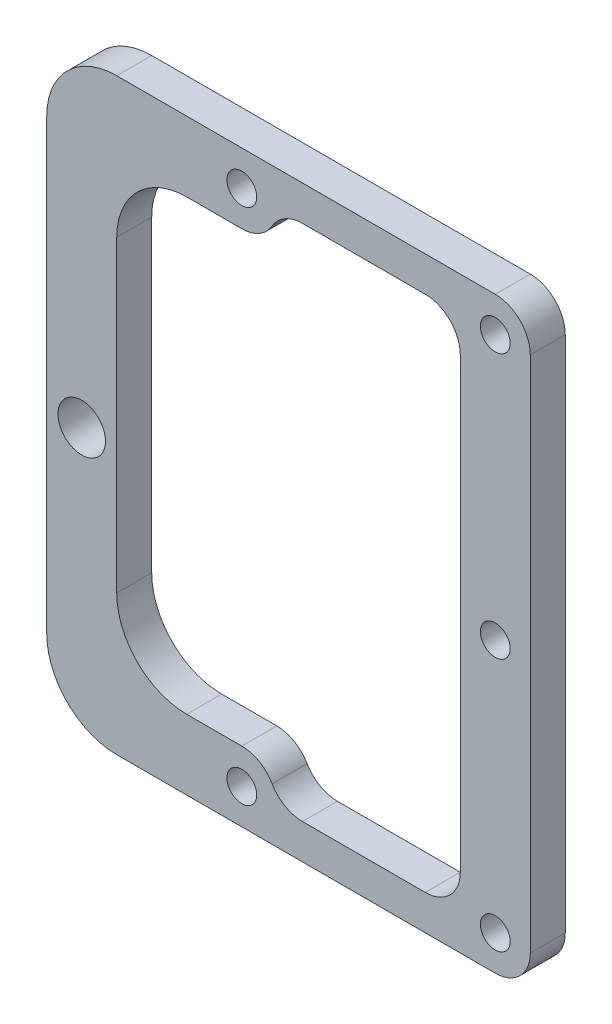
ISO-10303-21;
HEADER;
FILE_DESCRIPTION(('STEP AP214'),'2;1');
FILE_NAME('part.step','',(''),(''),'','','');
FILE_SCHEMA(('AUTOMOTIVE_DESIGN { 1 0 10303 214 1 1 1 1 }'));
ENDSEC;
DATA;
#1=APPLICATION_CONTEXT('core data for automotive mechanical design processes');
#2=APPLICATION_PROTOCOL_DEFINITION('international standard','automotive_design',2000,#1);
#3=PRODUCT_CONTEXT('',#1,'mechanical');
#4=PRODUCT('Part','Part','',(#3));
#5=PRODUCT_RELATED_PRODUCT_CATEGORY('part','',(#4));
#6=PRODUCT_DEFINITION_FORMATION('','',#4);
#7=PRODUCT_DEFINITION_CONTEXT('part definition',#1,'design');
#8=PRODUCT_DEFINITION('design','',#6,#7);
#9=PRODUCT_DEFINITION_SHAPE('','',#8);
#10=(LENGTH_UNIT() NAMED_UNIT(*) SI_UNIT(.MILLI.,.METRE.));
#11=(NAMED_UNIT(*) PLANE_ANGLE_UNIT() SI_UNIT($,.RADIAN.));
#12=(NAMED_UNIT(*) SI_UNIT($,.STERADIAN.) SOLID_ANGLE_UNIT());
#13=UNCERTAINTY_MEASURE_WITH_UNIT(LENGTH_MEASURE(1.E-05),#10,'distance_accuracy_value','');
#14=(GEOMETRIC_REPRESENTATION_CONTEXT(3) GLOBAL_UNCERTAINTY_ASSIGNED_CONTEXT((#13)) GLOBAL_UNIT_ASSIGNED_CONTEXT((#10,
#11,#12)) REPRESENTATION_CONTEXT('',''));
#15=CARTESIAN_POINT('',(0.,0.,0.));
#16=DIRECTION('',(0.,0.,1.));
#17=DIRECTION('',(1.,0.,0.));
#18=AXIS2_PLACEMENT_3D('',#15,#16,#17);
#19=CARTESIAN_POINT('',(0.,0.,3.175));
#20=DIRECTION('',(0.,0.,-1.));
#21=DIRECTION('',(-1.,0.,0.));
#22=AXIS2_PLACEMENT_3D('',#19,#20,#21);
#23=CYLINDRICAL_SURFACE('',#22,3.175);
#24=CARTESIAN_POINT('',(0.,0.,0.));
#25=DIRECTION('',(0.,0.,1.));
#26=DIRECTION('',(1.,0.,0.));
#27=AXIS2_PLACEMENT_3D('',#24,#25,#26);
#28=CIRCLE('',#27,3.175);
#29=CARTESIAN_POINT('',(3.175,0.,0.));
#30=VERTEX_POINT('',#29);
#31=CARTESIAN_POINT('',(0.,3.175,0.));
#32=VERTEX_POINT('',#31);
#33=EDGE_CURVE('E263',#30,#32,#28,.T.);
#34=ORIENTED_EDGE('',*,*,#33,.T.);
#35=DIRECTION('',(0.,0.,-1.));
#36=VECTOR('',#35,1.);
#37=CARTESIAN_POINT('',(0.,3.175,3.175));
#38=LINE('',#37,#36);
#39=CARTESIAN_POINT('',(0.,3.175,3.175));
#40=VERTEX_POINT('',#39);
#41=EDGE_CURVE('E285',#40,#32,#38,.T.);
#42=ORIENTED_EDGE('',*,*,#41,.F.);
#43=CARTESIAN_POINT('',(0.,0.,3.175));
#44=DIRECTION('',(0.,0.,1.));
#45=DIRECTION('',(1.,0.,0.));
#46=AXIS2_PLACEMENT_3D('',#43,#44,#45);
#47=CIRCLE('',#46,3.175);
#48=CARTESIAN_POINT('',(3.175,0.,3.175));
#49=VERTEX_POINT('',#48);
#50=EDGE_CURVE('E228',#49,#40,#47,.T.);
#51=ORIENTED_EDGE('',*,*,#50,.F.);
#52=DIRECTION('',(0.,0.,-1.));
#53=VECTOR('',#52,1.);
#54=CARTESIAN_POINT('',(3.175,0.,3.175));
#55=LINE('',#54,#53);
#56=EDGE_CURVE('E206',#49,#30,#55,.T.);
#57=ORIENTED_EDGE('',*,*,#56,.T.);
#58=EDGE_LOOP('',(#34,#42,#51,#57));
#59=FACE_BOUND('',#58,.T.);
#60=ADVANCED_FACE('F35',(#59),#23,.T.);
#61=CARTESIAN_POINT('',(0.,3.175,3.175));
#62=DIRECTION('',(0.,1.,0.));
#63=DIRECTION('',(-1.,0.,0.));
#64=AXIS2_PLACEMENT_3D('',#61,#62,#63);
#65=PLANE('',#64);
#66=DIRECTION('',(1.,0.,0.));
#67=VECTOR('',#66,1.);
#68=CARTESIAN_POINT('',(0.,3.175,0.));
#69=LINE('',#68,#67);
#70=CARTESIAN_POINT('',(-34.3482579999999,3.175,0.));
#71=VERTEX_POINT('',#70);
#72=EDGE_CURVE('E266',#71,#32,#69,.T.);
#73=ORIENTED_EDGE('',*,*,#72,.F.);
#74=DIRECTION('',(0.,0.,-1.));
#75=VECTOR('',#74,1.);
#76=CARTESIAN_POINT('',(-34.3482579999999,3.175,3.175));
#77=LINE('',#76,#75);
#78=CARTESIAN_POINT('',(-34.3482579999999,3.175,3.175));
#79=VERTEX_POINT('',#78);
#80=EDGE_CURVE('E333',#71,#79,#77,.F.);
#81=ORIENTED_EDGE('',*,*,#80,.T.);
#82=DIRECTION('',(1.,0.,0.));
#83=VECTOR('',#82,1.);
#84=CARTESIAN_POINT('',(0.,3.175,3.175));
#85=LINE('',#84,#83);
#86=EDGE_CURVE('E231',#79,#40,#85,.T.);
#87=ORIENTED_EDGE('',*,*,#86,.T.);
#88=ORIENTED_EDGE('',*,*,#41,.T.);
#89=EDGE_LOOP('',(#73,#81,#87,#88));
#90=FACE_BOUND('',#89,.T.);
#91=ADVANCED_FACE('F470',(#90),#65,.T.);
#92=CARTESIAN_POINT('',(-40.6982579999999,0.,3.175));
#93=DIRECTION('',(-1.,0.,0.));
#94=DIRECTION('',(0.,0.,1.));
#95=AXIS2_PLACEMENT_3D('',#92,#93,#94);
#96=PLANE('',#95);
#97=DIRECTION('',(0.,1.,0.));
#98=VECTOR('',#97,1.);
#99=CARTESIAN_POINT('',(-40.6982579999999,0.,3.175));
#100=LINE('',#99,#98);
#101=CARTESIAN_POINT('',(-40.6982579999999,-43.825,3.175));
#102=VERTEX_POINT('',#101);
#103=CARTESIAN_POINT('',(-40.6982579999999,-3.175,3.175));
#104=VERTEX_POINT('',#103);
#105=EDGE_CURVE('E233',#102,#104,#100,.T.);
#106=ORIENTED_EDGE('',*,*,#105,.T.);
#107=DIRECTION('',(0.,0.,-1.));
#108=VECTOR('',#107,1.);
#109=CARTESIAN_POINT('',(-40.6982579999999,-3.175,3.175));
#110=LINE('',#109,#108);
#111=CARTESIAN_POINT('',(-40.6982579999999,-3.175,0.));
#112=VERTEX_POINT('',#111);
#113=EDGE_CURVE('E326',#104,#112,#110,.T.);
#114=ORIENTED_EDGE('',*,*,#113,.T.);
#115=DIRECTION('',(0.,1.,0.));
#116=VECTOR('',#115,1.);
#117=CARTESIAN_POINT('',(-40.6982579999999,0.,0.));
#118=LINE('',#117,#116);
#119=CARTESIAN_POINT('',(-40.6982579999999,-43.825,0.));
#120=VERTEX_POINT('',#119);
#121=EDGE_CURVE('E268',#120,#112,#118,.T.);
#122=ORIENTED_EDGE('',*,*,#121,.F.);
#123=DIRECTION('',(0.,0.,-1.));
#124=VECTOR('',#123,1.);
#125=CARTESIAN_POINT('',(-40.6982579999999,-43.825,3.175));
#126=LINE('',#125,#124);
#127=EDGE_CURVE('E324',#120,#102,#126,.F.);
#128=ORIENTED_EDGE('',*,*,#127,.T.);
#129=EDGE_LOOP('',(#106,#114,#122,#128));
#130=FACE_BOUND('',#129,.T.);
#131=ADVANCED_FACE('F476',(#130),#96,.T.);
#132=CARTESIAN_POINT('',(0.,-50.175,3.175));
#133=DIRECTION('',(0.,-1.,0.));
#134=DIRECTION('',(0.,0.,-1.));
#135=AXIS2_PLACEMENT_3D('',#132,#133,#134);
#136=PLANE('',#135);
#137=DIRECTION('',(-1.,0.,0.));
#138=VECTOR('',#137,1.);
#139=CARTESIAN_POINT('',(0.,-50.175,3.175));
#140=LINE('',#139,#138);
#141=CARTESIAN_POINT('',(0.,-50.175,3.175));
#142=VERTEX_POINT('',#141);
#143=CARTESIAN_POINT('',(-34.3482579999999,-50.175,3.175));
#144=VERTEX_POINT('',#143);
#145=EDGE_CURVE('E236',#142,#144,#140,.T.);
#146=ORIENTED_EDGE('',*,*,#145,.T.);
#147=DIRECTION('',(0.,0.,-1.));
#148=VECTOR('',#147,1.);
#149=CARTESIAN_POINT('',(-34.3482579999999,-50.175,3.175));
#150=LINE('',#149,#148);
#151=CARTESIAN_POINT('',(-34.3482579999999,-50.175,0.));
#152=VERTEX_POINT('',#151);
#153=EDGE_CURVE('E338',#144,#152,#150,.T.);
#154=ORIENTED_EDGE('',*,*,#153,.T.);
#155=DIRECTION('',(-1.,0.,0.));
#156=VECTOR('',#155,1.);
#157=CARTESIAN_POINT('',(0.,-50.175,0.));
#158=LINE('',#157,#156);
#159=CARTESIAN_POINT('',(0.,-50.175,0.));
#160=VERTEX_POINT('',#159);
#161=EDGE_CURVE('E271',#160,#152,#158,.T.);
#162=ORIENTED_EDGE('',*,*,#161,.F.);
#163=DIRECTION('',(0.,0.,-1.));
#164=VECTOR('',#163,1.);
#165=CARTESIAN_POINT('',(0.,-50.175,3.175));
#166=LINE('',#165,#164);
#167=EDGE_CURVE('E283',#142,#160,#166,.T.);
#168=ORIENTED_EDGE('',*,*,#167,.F.);
#169=EDGE_LOOP('',(#146,#154,#162,#168));
#170=FACE_BOUND('',#169,.T.);
#171=ADVANCED_FACE('F582',(#170),#136,.T.);
#172=CARTESIAN_POINT('',(0.,-47.,3.175));
#173=DIRECTION('',(0.,0.,-1.));
#174=DIRECTION('',(-1.,0.,0.));
#175=AXIS2_PLACEMENT_3D('',#172,#173,#174);
#176=CYLINDRICAL_SURFACE('',#175,3.175);
#177=CARTESIAN_POINT('',(0.,-47.,0.));
#178=DIRECTION('',(0.,0.,1.));
#179=DIRECTION('',(1.,0.,0.));
#180=AXIS2_PLACEMENT_3D('',#177,#178,#179);
#181=CIRCLE('',#180,3.175);
#182=CARTESIAN_POINT('',(3.17500000000003,-47.,0.));
#183=VERTEX_POINT('',#182);
#184=EDGE_CURVE('E274',#160,#183,#181,.T.);
#185=ORIENTED_EDGE('',*,*,#184,.T.);
#186=DIRECTION('',(0.,0.,-1.));
#187=VECTOR('',#186,1.);
#188=CARTESIAN_POINT('',(3.17500000000003,-47.,3.175));
#189=LINE('',#188,#187);
#190=CARTESIAN_POINT('',(3.17500000000003,-47.,3.175));
#191=VERTEX_POINT('',#190);
#192=EDGE_CURVE('E280',#191,#183,#189,.T.);
#193=ORIENTED_EDGE('',*,*,#192,.F.);
#194=CARTESIAN_POINT('',(0.,-47.,3.175));
#195=DIRECTION('',(0.,0.,1.));
#196=DIRECTION('',(1.,0.,0.));
#197=AXIS2_PLACEMENT_3D('',#194,#195,#196);
#198=CIRCLE('',#197,3.175);
#199=EDGE_CURVE('E238',#142,#191,#198,.T.);
#200=ORIENTED_EDGE('',*,*,#199,.F.);
#201=ORIENTED_EDGE('',*,*,#167,.T.);
#202=EDGE_LOOP('',(#185,#193,#200,#201));
#203=FACE_BOUND('',#202,.T.);
#204=ADVANCED_FACE('F498',(#203),#176,.T.);
#205=CARTESIAN_POINT('',(0.,-47.,3.175));
#206=DIRECTION('',(0.,1.,0.));
#207=DIRECTION('',(0.,0.,1.));
#208=AXIS2_PLACEMENT_3D('',#205,#206,#207);
#209=PLANE('',#208);
#210=DIRECTION('',(1.,0.,0.));
#211=VECTOR('',#210,1.);
#212=CARTESIAN_POINT('',(0.,-47.,3.175));
#213=LINE('',#212,#211);
#214=CARTESIAN_POINT('',(-17.5007386859688,-47.,3.175));
#215=VERTEX_POINT('',#214);
#216=CARTESIAN_POINT('',(-6.34999999999997,-47.,3.175));
#217=VERTEX_POINT('',#216);
#218=EDGE_CURVE('E196',#215,#217,#213,.T.);
#219=ORIENTED_EDGE('',*,*,#218,.T.);
#220=DIRECTION('',(0.,0.,-1.));
#221=VECTOR('',#220,1.);
#222=CARTESIAN_POINT('',(-6.34999999999997,-47.,3.175));
#223=LINE('',#222,#221);
#224=CARTESIAN_POINT('',(-6.34999999999997,-47.,0.));
#225=VERTEX_POINT('',#224);
#226=EDGE_CURVE('E304',#217,#225,#223,.T.);
#227=ORIENTED_EDGE('',*,*,#226,.T.);
#228=DIRECTION('',(1.,0.,0.));
#229=VECTOR('',#228,1.);
#230=CARTESIAN_POINT('',(0.,-47.,0.));
#231=LINE('',#230,#229);
#232=CARTESIAN_POINT('',(-17.5007386859688,-47.,0.));
#233=VERTEX_POINT('',#232);
#234=EDGE_CURVE('E242',#233,#225,#231,.T.);
#235=ORIENTED_EDGE('',*,*,#234,.F.);
#236=DIRECTION('',(0.,0.,-1.));
#237=VECTOR('',#236,1.);
#238=CARTESIAN_POINT('',(-17.5007386859688,-47.,3.175));
#239=LINE('',#238,#237);
#240=EDGE_CURVE('E302',#233,#215,#239,.F.);
#241=ORIENTED_EDGE('',*,*,#240,.T.);
#242=EDGE_LOOP('',(#219,#227,#235,#241));
#243=FACE_BOUND('',#242,.T.);
#244=ADVANCED_FACE('F397',(#243),#209,.T.);
#245=CARTESIAN_POINT('',(-23.,-47.,3.175));
#246=DIRECTION('',(0.,0.,-1.));
#247=DIRECTION('',(-1.,0.,0.));
#248=AXIS2_PLACEMENT_3D('',#245,#246,#247);
#249=CYLINDRICAL_SURFACE('',#248,3.175);
#250=CARTESIAN_POINT('',(-23.,-47.,3.175));
#251=DIRECTION('',(0.,0.,1.));
#252=DIRECTION('',(1.,0.,0.));
#253=AXIS2_PLACEMENT_3D('',#250,#251,#252);
#254=CIRCLE('',#253,3.175);
#255=CARTESIAN_POINT('',(-20.2503693429844,-45.4125,3.175));
#256=VERTEX_POINT('',#255);
#257=CARTESIAN_POINT('',(-23.,-43.825,3.175));
#258=VERTEX_POINT('',#257);
#259=EDGE_CURVE('E184',#256,#258,#254,.T.);
#260=ORIENTED_EDGE('',*,*,#259,.F.);
#261=DIRECTION('',(0.,0.,-1.));
#262=VECTOR('',#261,1.);
#263=CARTESIAN_POINT('',(-20.2503693429844,-45.4125,3.175));
#264=LINE('',#263,#262);
#265=CARTESIAN_POINT('',(-20.2503693429844,-45.4125,0.));
#266=VERTEX_POINT('',#265);
#267=EDGE_CURVE('E307',#256,#266,#264,.T.);
#268=ORIENTED_EDGE('',*,*,#267,.T.);
#269=CARTESIAN_POINT('',(-23.,-47.,0.));
#270=DIRECTION('',(0.,0.,1.));
#271=DIRECTION('',(1.,0.,0.));
#272=AXIS2_PLACEMENT_3D('',#269,#270,#271);
#273=CIRCLE('',#272,3.175);
#274=CARTESIAN_POINT('',(-23.,-43.825,0.));
#275=VERTEX_POINT('',#274);
#276=EDGE_CURVE('E202',#266,#275,#273,.T.);
#277=ORIENTED_EDGE('',*,*,#276,.T.);
#278=DIRECTION('',(0.,0.,-1.));
#279=VECTOR('',#278,1.);
#280=CARTESIAN_POINT('',(-23.,-43.825,3.175));
#281=LINE('',#280,#279);
#282=EDGE_CURVE('E199',#258,#275,#281,.T.);
#283=ORIENTED_EDGE('',*,*,#282,.F.);
#284=EDGE_LOOP('',(#260,#268,#277,#283));
#285=FACE_BOUND('',#284,.T.);
#286=ADVANCED_FACE('F200',(#285),#249,.T.);
#287=CARTESIAN_POINT('',(0.,-43.825,3.175));
#288=DIRECTION('',(0.,-1.,0.));
#289=DIRECTION('',(0.,0.,-1.));
#290=AXIS2_PLACEMENT_3D('',#287,#288,#289);
#291=PLANE('',#290);
#292=DIRECTION('',(-1.,0.,0.));
#293=VECTOR('',#292,1.);
#294=CARTESIAN_POINT('',(0.,-43.825,0.));
#295=LINE('',#294,#293);
#296=CARTESIAN_POINT('',(-27.9982579999999,-43.825,0.));
#297=VERTEX_POINT('',#296);
#298=EDGE_CURVE('E247',#275,#297,#295,.T.);
#299=ORIENTED_EDGE('',*,*,#298,.T.);
#300=DIRECTION('',(0.,0.,-1.));
#301=VECTOR('',#300,1.);
#302=CARTESIAN_POINT('',(-27.9982579999999,-43.825,3.175));
#303=LINE('',#302,#301);
#304=CARTESIAN_POINT('',(-27.9982579999999,-43.825,3.175));
#305=VERTEX_POINT('',#304);
#306=EDGE_CURVE('E211',#297,#305,#303,.F.);
#307=ORIENTED_EDGE('',*,*,#306,.T.);
#308=DIRECTION('',(-1.,0.,0.));
#309=VECTOR('',#308,1.);
#310=CARTESIAN_POINT('',(0.,-43.825,3.175));
#311=LINE('',#310,#309);
#312=EDGE_CURVE('E189',#258,#305,#311,.T.);
#313=ORIENTED_EDGE('',*,*,#312,.F.);
#314=ORIENTED_EDGE('',*,*,#282,.T.);
#315=EDGE_LOOP('',(#299,#307,#313,#314));
#316=FACE_BOUND('',#315,.T.);
#317=ADVANCED_FACE('F209',(#316),#291,.F.);
#318=CARTESIAN_POINT('',(-34.3482579999999,0.,3.175));
#319=DIRECTION('',(-1.,0.,0.));
#320=DIRECTION('',(0.,0.,1.));
#321=AXIS2_PLACEMENT_3D('',#318,#319,#320);
#322=PLANE('',#321);
#323=DIRECTION('',(0.,1.,0.));
#324=VECTOR('',#323,1.);
#325=CARTESIAN_POINT('',(-34.3482579999999,0.,3.175));
#326=LINE('',#325,#324);
#327=CARTESIAN_POINT('',(-34.3482579999999,-37.475,3.175));
#328=VERTEX_POINT('',#327);
#329=CARTESIAN_POINT('',(-34.3482579999999,-9.525,3.175));
#330=VERTEX_POINT('',#329);
#331=EDGE_CURVE('E212',#328,#330,#326,.T.);
#332=ORIENTED_EDGE('',*,*,#331,.F.);
#333=DIRECTION('',(0.,0.,-1.));
#334=VECTOR('',#333,1.);
#335=CARTESIAN_POINT('',(-34.3482579999999,-37.475,0.));
#336=LINE('',#335,#334);
#337=CARTESIAN_POINT('',(-34.3482579999999,-37.475,0.));
#338=VERTEX_POINT('',#337);
#339=EDGE_CURVE('E343',#328,#338,#336,.T.);
#340=ORIENTED_EDGE('',*,*,#339,.T.);
#341=DIRECTION('',(0.,1.,0.));
#342=VECTOR('',#341,1.);
#343=CARTESIAN_POINT('',(-34.3482579999999,0.,0.));
#344=LINE('',#343,#342);
#345=CARTESIAN_POINT('',(-34.3482579999999,-9.525,0.));
#346=VERTEX_POINT('',#345);
#347=EDGE_CURVE('E249',#338,#346,#344,.T.);
#348=ORIENTED_EDGE('',*,*,#347,.T.);
#349=DIRECTION('',(0.,0.,-1.));
#350=VECTOR('',#349,1.);
#351=CARTESIAN_POINT('',(-34.3482579999999,-9.525,3.175));
#352=LINE('',#351,#350);
#353=EDGE_CURVE('E341',#346,#330,#352,.F.);
#354=ORIENTED_EDGE('',*,*,#353,.T.);
#355=EDGE_LOOP('',(#332,#340,#348,#354));
#356=FACE_BOUND('',#355,.T.);
#357=ADVANCED_FACE('F364',(#356),#322,.F.);
#358=CARTESIAN_POINT('',(0.,-3.175,3.175));
#359=DIRECTION('',(0.,1.,0.));
#360=DIRECTION('',(-1.,0.,0.));
#361=AXIS2_PLACEMENT_3D('',#358,#359,#360);
#362=PLANE('',#361);
#363=DIRECTION('',(1.,0.,0.));
#364=VECTOR('',#363,1.);
#365=CARTESIAN_POINT('',(0.,-3.175,3.175));
#366=LINE('',#365,#364);
#367=CARTESIAN_POINT('',(-27.9982579999999,-3.175,3.175));
#368=VERTEX_POINT('',#367);
#369=CARTESIAN_POINT('',(-23.,-3.175,3.175));
#370=VERTEX_POINT('',#369);
#371=EDGE_CURVE('E214',#368,#370,#366,.T.);
#372=ORIENTED_EDGE('',*,*,#371,.F.);
#373=DIRECTION('',(0.,0.,-1.));
#374=VECTOR('',#373,1.);
#375=CARTESIAN_POINT('',(-27.9982579999999,-3.175,0.));
#376=LINE('',#375,#374);
#377=CARTESIAN_POINT('',(-27.9982579999999,-3.175,0.));
#378=VERTEX_POINT('',#377);
#379=EDGE_CURVE('E347',#368,#378,#376,.T.);
#380=ORIENTED_EDGE('',*,*,#379,.T.);
#381=DIRECTION('',(1.,0.,0.));
#382=VECTOR('',#381,1.);
#383=CARTESIAN_POINT('',(0.,-3.175,0.));
#384=LINE('',#383,#382);
#385=CARTESIAN_POINT('',(-23.,-3.175,0.));
#386=VERTEX_POINT('',#385);
#387=EDGE_CURVE('E252',#378,#386,#384,.T.);
#388=ORIENTED_EDGE('',*,*,#387,.T.);
#389=DIRECTION('',(0.,0.,-1.));
#390=VECTOR('',#389,1.);
#391=CARTESIAN_POINT('',(-23.,-3.175,3.175));
#392=LINE('',#391,#390);
#393=EDGE_CURVE('E207',#370,#386,#392,.T.);
#394=ORIENTED_EDGE('',*,*,#393,.F.);
#395=EDGE_LOOP('',(#372,#380,#388,#394));
#396=FACE_BOUND('',#395,.T.);
#397=ADVANCED_FACE('F367',(#396),#362,.F.);
#398=CARTESIAN_POINT('',(-23.,0.,3.175));
#399=DIRECTION('',(0.,0.,-1.));
#400=DIRECTION('',(-1.,0.,0.));
#401=AXIS2_PLACEMENT_3D('',#398,#399,#400);
#402=CYLINDRICAL_SURFACE('',#401,3.175);
#403=CARTESIAN_POINT('',(-23.,0.,0.));
#404=DIRECTION('',(0.,0.,1.));
#405=DIRECTION('',(1.,0.,0.));
#406=AXIS2_PLACEMENT_3D('',#403,#404,#405);
#407=CIRCLE('',#406,3.175);
#408=CARTESIAN_POINT('',(-20.2503693429844,-1.5875,0.));
#409=VERTEX_POINT('',#408);
#410=EDGE_CURVE('E254',#386,#409,#407,.T.);
#411=ORIENTED_EDGE('',*,*,#410,.T.);
#412=DIRECTION('',(0.,0.,-1.));
#413=VECTOR('',#412,1.);
#414=CARTESIAN_POINT('',(-20.2503693429844,-1.5875,3.175));
#415=LINE('',#414,#413);
#416=CARTESIAN_POINT('',(-20.2503693429844,-1.5875,3.175));
#417=VERTEX_POINT('',#416);
#418=EDGE_CURVE('E295',#409,#417,#415,.F.);
#419=ORIENTED_EDGE('',*,*,#418,.T.);
#420=CARTESIAN_POINT('',(-23.,0.,3.175));
#421=DIRECTION('',(0.,0.,1.));
#422=DIRECTION('',(1.,0.,0.));
#423=AXIS2_PLACEMENT_3D('',#420,#421,#422);
#424=CIRCLE('',#423,3.175);
#425=EDGE_CURVE('E219',#370,#417,#424,.T.);
#426=ORIENTED_EDGE('',*,*,#425,.F.);
#427=ORIENTED_EDGE('',*,*,#393,.T.);
#428=EDGE_LOOP('',(#411,#419,#426,#427));
#429=FACE_BOUND('',#428,.T.);
#430=ADVANCED_FACE('F485',(#429),#402,.T.);
#431=CARTESIAN_POINT('',(0.,0.,3.175));
#432=DIRECTION('',(0.,1.,0.));
#433=DIRECTION('',(-1.,0.,0.));
#434=AXIS2_PLACEMENT_3D('',#431,#432,#433);
#435=PLANE('',#434);
#436=DIRECTION('',(1.,0.,0.));
#437=VECTOR('',#436,1.);
#438=CARTESIAN_POINT('',(0.,0.,3.175));
#439=LINE('',#438,#437);
#440=CARTESIAN_POINT('',(-17.5007386859688,0.,3.175));
#441=VERTEX_POINT('',#440);
#442=CARTESIAN_POINT('',(-6.35,0.,3.175));
#443=VERTEX_POINT('',#442);
#444=EDGE_CURVE('E222',#441,#443,#439,.T.);
#445=ORIENTED_EDGE('',*,*,#444,.F.);
#446=DIRECTION('',(0.,0.,1.));
#447=VECTOR('',#446,1.);
#448=CARTESIAN_POINT('',(-17.5007386859688,0.,0.));
#449=LINE('',#448,#447);
#450=CARTESIAN_POINT('',(-17.5007386859688,0.,0.));
#451=VERTEX_POINT('',#450);
#452=EDGE_CURVE('E292',#441,#451,#449,.F.);
#453=ORIENTED_EDGE('',*,*,#452,.T.);
#454=DIRECTION('',(1.,0.,0.));
#455=VECTOR('',#454,1.);
#456=CARTESIAN_POINT('',(0.,0.,0.));
#457=LINE('',#456,#455);
#458=CARTESIAN_POINT('',(-6.35,0.,0.));
#459=VERTEX_POINT('',#458);
#460=EDGE_CURVE('E257',#451,#459,#457,.T.);
#461=ORIENTED_EDGE('',*,*,#460,.T.);
#462=DIRECTION('',(0.,0.,-1.));
#463=VECTOR('',#462,1.);
#464=CARTESIAN_POINT('',(-6.35,0.,3.175));
#465=LINE('',#464,#463);
#466=EDGE_CURVE('E288',#459,#443,#465,.F.);
#467=ORIENTED_EDGE('',*,*,#466,.T.);
#468=EDGE_LOOP('',(#445,#453,#461,#467));
#469=FACE_BOUND('',#468,.T.);
#470=ADVANCED_FACE('F379',(#469),#435,.F.);
#471=CARTESIAN_POINT('',(-3.175,0.,3.175));
#472=DIRECTION('',(1.,0.,0.));
#473=DIRECTION('',(0.,1.,0.));
#474=AXIS2_PLACEMENT_3D('',#471,#472,#473);
#475=PLANE('',#474);
#476=DIRECTION('',(0.,-1.,0.));
#477=VECTOR('',#476,1.);
#478=CARTESIAN_POINT('',(-3.175,0.,3.175));
#479=LINE('',#478,#477);
#480=CARTESIAN_POINT('',(-3.175,-3.175,3.175));
#481=VERTEX_POINT('',#480);
#482=CARTESIAN_POINT('',(-3.17499999999997,-43.825,3.175));
#483=VERTEX_POINT('',#482);
#484=EDGE_CURVE('E225',#481,#483,#479,.T.);
#485=ORIENTED_EDGE('',*,*,#484,.F.);
#486=DIRECTION('',(0.,0.,-1.));
#487=VECTOR('',#486,1.);
#488=CARTESIAN_POINT('',(-3.175,-3.175,0.));
#489=LINE('',#488,#487);
#490=CARTESIAN_POINT('',(-3.175,-3.175,0.));
#491=VERTEX_POINT('',#490);
#492=EDGE_CURVE('E299',#481,#491,#489,.T.);
#493=ORIENTED_EDGE('',*,*,#492,.T.);
#494=DIRECTION('',(0.,-1.,0.));
#495=VECTOR('',#494,1.);
#496=CARTESIAN_POINT('',(-3.175,0.,0.));
#497=LINE('',#496,#495);
#498=CARTESIAN_POINT('',(-3.17499999999997,-43.825,0.));
#499=VERTEX_POINT('',#498);
#500=EDGE_CURVE('E260',#491,#499,#497,.T.);
#501=ORIENTED_EDGE('',*,*,#500,.T.);
#502=DIRECTION('',(0.,0.,-1.));
#503=VECTOR('',#502,1.);
#504=CARTESIAN_POINT('',(-3.17499999999997,-43.825,3.175));
#505=LINE('',#504,#503);
#506=EDGE_CURVE('E297',#499,#483,#505,.F.);
#507=ORIENTED_EDGE('',*,*,#506,.T.);
#508=EDGE_LOOP('',(#485,#493,#501,#507));
#509=FACE_BOUND('',#508,.T.);
#510=ADVANCED_FACE('F388',(#509),#475,.F.);
#511=CARTESIAN_POINT('',(3.175,0.,3.175));
#512=DIRECTION('',(-1.,0.,0.));
#513=DIRECTION('',(0.,-1.,0.));
#514=AXIS2_PLACEMENT_3D('',#511,#512,#513);
#515=PLANE('',#514);
#516=DIRECTION('',(0.,1.,0.));
#517=VECTOR('',#516,1.);
#518=CARTESIAN_POINT('',(3.175,0.,0.));
#519=LINE('',#518,#517);
#520=EDGE_CURVE('E276',#183,#30,#519,.T.);
#521=ORIENTED_EDGE('',*,*,#520,.T.);
#522=ORIENTED_EDGE('',*,*,#56,.F.);
#523=DIRECTION('',(0.,1.,0.));
#524=VECTOR('',#523,1.);
#525=CARTESIAN_POINT('',(3.175,0.,3.175));
#526=LINE('',#525,#524);
#527=EDGE_CURVE('E240',#191,#49,#526,.T.);
#528=ORIENTED_EDGE('',*,*,#527,.F.);
#529=ORIENTED_EDGE('',*,*,#192,.T.);
#530=EDGE_LOOP('',(#521,#522,#528,#529));
#531=FACE_BOUND('',#530,.T.);
#532=ADVANCED_FACE('F442',(#531),#515,.F.);
#533=CARTESIAN_POINT('',(0.,0.,3.175));
#534=DIRECTION('',(0.,0.,1.));
#535=DIRECTION('',(1.,0.,0.));
#536=AXIS2_PLACEMENT_3D('',#533,#534,#535);
#537=PLANE('',#536);
#538=CARTESIAN_POINT('',(-23.,-47.,3.175));
#539=DIRECTION('',(0.,0.,1.));
#540=DIRECTION('',(1.,0.,0.));
#541=AXIS2_PLACEMENT_3D('',#538,#539,#540);
#542=CIRCLE('',#541,1.35254999999999);
#543=CARTESIAN_POINT('',(-21.64745,-47.,3.175));
#544=VERTEX_POINT('',#543);
#545=EDGE_CURVE('E434',#544,#544,#542,.T.);
#546=ORIENTED_EDGE('',*,*,#545,.F.);
#547=EDGE_LOOP('',(#546));
#548=FACE_BOUND('',#547,.T.);
#549=CARTESIAN_POINT('',(0.,-47.,3.175));
#550=DIRECTION('',(0.,0.,1.));
#551=DIRECTION('',(1.,0.,0.));
#552=AXIS2_PLACEMENT_3D('',#549,#550,#551);
#553=CIRCLE('',#552,1.35254999999999);
#554=CARTESIAN_POINT('',(1.35255000000002,-47.,3.175));
#555=VERTEX_POINT('',#554);
#556=EDGE_CURVE('E428',#555,#555,#553,.T.);
#557=ORIENTED_EDGE('',*,*,#556,.F.);
#558=EDGE_LOOP('',(#557));
#559=FACE_BOUND('',#558,.T.);
#560=CARTESIAN_POINT('',(0.,0.,3.175));
#561=DIRECTION('',(0.,0.,1.));
#562=DIRECTION('',(1.,0.,0.));
#563=AXIS2_PLACEMENT_3D('',#560,#561,#562);
#564=CIRCLE('',#563,1.35254999999999);
#565=CARTESIAN_POINT('',(1.35254999999999,0.,3.175));
#566=VERTEX_POINT('',#565);
#567=EDGE_CURVE('E422',#566,#566,#564,.T.);
#568=ORIENTED_EDGE('',*,*,#567,.F.);
#569=EDGE_LOOP('',(#568));
#570=FACE_BOUND('',#569,.T.);
#571=CARTESIAN_POINT('',(-23.,0.,3.175));
#572=DIRECTION('',(0.,0.,1.));
#573=DIRECTION('',(1.,0.,0.));
#574=AXIS2_PLACEMENT_3D('',#571,#572,#573);
#575=CIRCLE('',#574,1.35254999999999);
#576=CARTESIAN_POINT('',(-21.64745,0.,3.175));
#577=VERTEX_POINT('',#576);
#578=EDGE_CURVE('E416',#577,#577,#575,.T.);
#579=ORIENTED_EDGE('',*,*,#578,.F.);
#580=EDGE_LOOP('',(#579));
#581=FACE_BOUND('',#580,.T.);
#582=CARTESIAN_POINT('',(0.,-24.,3.175));
#583=DIRECTION('',(0.,0.,1.));
#584=DIRECTION('',(1.,0.,0.));
#585=AXIS2_PLACEMENT_3D('',#582,#583,#584);
#586=CIRCLE('',#585,1.35254999999999);
#587=CARTESIAN_POINT('',(1.35255000000002,-24.,3.175));
#588=VERTEX_POINT('',#587);
#589=EDGE_CURVE('E410',#588,#588,#586,.T.);
#590=ORIENTED_EDGE('',*,*,#589,.F.);
#591=EDGE_LOOP('',(#590));
#592=FACE_BOUND('',#591,.T.);
#593=CARTESIAN_POINT('',(-37.5232579999999,-26.062402,3.175));
#594=DIRECTION('',(0.,0.,1.));
#595=DIRECTION('',(1.,0.,0.));
#596=AXIS2_PLACEMENT_3D('',#593,#594,#595);
#597=CIRCLE('',#596,2.15264999999999);
#598=CARTESIAN_POINT('',(-35.3706079999999,-26.062402,3.175));
#599=VERTEX_POINT('',#598);
#600=EDGE_CURVE('E404',#599,#599,#597,.T.);
#601=ORIENTED_EDGE('',*,*,#600,.F.);
#602=EDGE_LOOP('',(#601));
#603=FACE_BOUND('',#602,.T.);
#604=ORIENTED_EDGE('',*,*,#218,.F.);
#605=CARTESIAN_POINT('',(-17.5007386859688,-43.825,3.175));
#606=DIRECTION('',(0.,0.,1.));
#607=DIRECTION('',(1.,0.,0.));
#608=AXIS2_PLACEMENT_3D('',#605,#606,#607);
#609=CIRCLE('',#608,3.175);
#610=EDGE_CURVE('E192',#215,#256,#609,.F.);
#611=ORIENTED_EDGE('',*,*,#610,.T.);
#612=ORIENTED_EDGE('',*,*,#259,.T.);
#613=ORIENTED_EDGE('',*,*,#312,.T.);
#614=CARTESIAN_POINT('',(-27.9982579999999,-37.475,3.175));
#615=DIRECTION('',(0.,0.,1.));
#616=DIRECTION('',(1.,0.,0.));
#617=AXIS2_PLACEMENT_3D('',#614,#615,#616);
#618=CIRCLE('',#617,6.35);
#619=EDGE_CURVE('E352',#305,#328,#618,.F.);
#620=ORIENTED_EDGE('',*,*,#619,.T.);
#621=ORIENTED_EDGE('',*,*,#331,.T.);
#622=CARTESIAN_POINT('',(-27.9982579999999,-9.525,3.175));
#623=DIRECTION('',(0.,0.,1.));
#624=DIRECTION('',(1.,0.,0.));
#625=AXIS2_PLACEMENT_3D('',#622,#623,#624);
#626=CIRCLE('',#625,6.35);
#627=EDGE_CURVE('E11',#330,#368,#626,.F.);
#628=ORIENTED_EDGE('',*,*,#627,.T.);
#629=ORIENTED_EDGE('',*,*,#371,.T.);
#630=ORIENTED_EDGE('',*,*,#425,.T.);
#631=CARTESIAN_POINT('',(-17.5007386859688,-3.175,3.175));
#632=DIRECTION('',(0.,0.,1.));
#633=DIRECTION('',(1.,0.,0.));
#634=AXIS2_PLACEMENT_3D('',#631,#632,#633);
#635=CIRCLE('',#634,3.175);
#636=EDGE_CURVE('E311',#417,#441,#635,.F.);
#637=ORIENTED_EDGE('',*,*,#636,.T.);
#638=ORIENTED_EDGE('',*,*,#444,.T.);
#639=CARTESIAN_POINT('',(-6.35,-3.175,3.175));
#640=DIRECTION('',(0.,0.,1.));
#641=DIRECTION('',(1.,0.,0.));
#642=AXIS2_PLACEMENT_3D('',#639,#640,#641);
#643=CIRCLE('',#642,3.175);
#644=EDGE_CURVE('E315',#443,#481,#643,.F.);
#645=ORIENTED_EDGE('',*,*,#644,.T.);
#646=ORIENTED_EDGE('',*,*,#484,.T.);
#647=CARTESIAN_POINT('',(-6.34999999999997,-43.825,3.175));
#648=DIRECTION('',(0.,0.,1.));
#649=DIRECTION('',(1.,0.,0.));
#650=AXIS2_PLACEMENT_3D('',#647,#648,#649);
#651=CIRCLE('',#650,3.175);
#652=EDGE_CURVE('E319',#483,#217,#651,.F.);
#653=ORIENTED_EDGE('',*,*,#652,.T.);
#654=EDGE_LOOP('',(#604,#611,#612,#613,#620,#621,#628,#629,#630,#637,#638,#645,#646,#653));
#655=FACE_BOUND('',#654,.T.);
#656=ORIENTED_EDGE('',*,*,#86,.F.);
#657=CARTESIAN_POINT('',(-34.3482579999999,-3.175,3.175));
#658=DIRECTION('',(0.,0.,1.));
#659=DIRECTION('',(1.,0.,0.));
#660=AXIS2_PLACEMENT_3D('',#657,#658,#659);
#661=CIRCLE('',#660,6.35);
#662=EDGE_CURVE('E336',#79,#104,#661,.T.);
#663=ORIENTED_EDGE('',*,*,#662,.T.);
#664=ORIENTED_EDGE('',*,*,#105,.F.);
#665=CARTESIAN_POINT('',(-34.3482579999999,-43.825,3.175));
#666=DIRECTION('',(0.,0.,1.));
#667=DIRECTION('',(1.,0.,0.));
#668=AXIS2_PLACEMENT_3D('',#665,#666,#667);
#669=CIRCLE('',#668,6.35);
#670=EDGE_CURVE('E50',#102,#144,#669,.T.);
#671=ORIENTED_EDGE('',*,*,#670,.T.);
#672=ORIENTED_EDGE('',*,*,#145,.F.);
#673=ORIENTED_EDGE('',*,*,#199,.T.);
#674=ORIENTED_EDGE('',*,*,#527,.T.);
#675=ORIENTED_EDGE('',*,*,#50,.T.);
#676=EDGE_LOOP('',(#656,#663,#664,#671,#672,#673,#674,#675));
#677=FACE_BOUND('',#676,.T.);
#678=ADVANCED_FACE('F187',(#548,#559,#570,#581,#592,#603,#655,#677),#537,.T.);
#679=CARTESIAN_POINT('',(0.,0.,0.));
#680=DIRECTION('',(0.,0.,1.));
#681=DIRECTION('',(1.,0.,0.));
#682=AXIS2_PLACEMENT_3D('',#679,#680,#681);
#683=PLANE('',#682);
#684=CARTESIAN_POINT('',(-23.,-47.,0.));
#685=DIRECTION('',(0.,0.,1.));
#686=DIRECTION('',(1.,0.,0.));
#687=AXIS2_PLACEMENT_3D('',#684,#685,#686);
#688=CIRCLE('',#687,1.35254999999999);
#689=CARTESIAN_POINT('',(-21.64745,-47.,0.));
#690=VERTEX_POINT('',#689);
#691=EDGE_CURVE('E431',#690,#690,#688,.T.);
#692=ORIENTED_EDGE('',*,*,#691,.T.);
#693=EDGE_LOOP('',(#692));
#694=FACE_BOUND('',#693,.T.);
#695=CARTESIAN_POINT('',(0.,-47.,0.));
#696=DIRECTION('',(0.,0.,1.));
#697=DIRECTION('',(1.,0.,0.));
#698=AXIS2_PLACEMENT_3D('',#695,#696,#697);
#699=CIRCLE('',#698,1.35254999999999);
#700=CARTESIAN_POINT('',(1.35255000000002,-47.,0.));
#701=VERTEX_POINT('',#700);
#702=EDGE_CURVE('E425',#701,#701,#699,.T.);
#703=ORIENTED_EDGE('',*,*,#702,.T.);
#704=EDGE_LOOP('',(#703));
#705=FACE_BOUND('',#704,.T.);
#706=CARTESIAN_POINT('',(0.,0.,0.));
#707=DIRECTION('',(0.,0.,1.));
#708=DIRECTION('',(1.,0.,0.));
#709=AXIS2_PLACEMENT_3D('',#706,#707,#708);
#710=CIRCLE('',#709,1.35254999999999);
#711=CARTESIAN_POINT('',(1.35254999999999,0.,0.));
#712=VERTEX_POINT('',#711);
#713=EDGE_CURVE('E419',#712,#712,#710,.T.);
#714=ORIENTED_EDGE('',*,*,#713,.T.);
#715=EDGE_LOOP('',(#714));
#716=FACE_BOUND('',#715,.T.);
#717=CARTESIAN_POINT('',(-23.,0.,0.));
#718=DIRECTION('',(0.,0.,1.));
#719=DIRECTION('',(1.,0.,0.));
#720=AXIS2_PLACEMENT_3D('',#717,#718,#719);
#721=CIRCLE('',#720,1.35254999999999);
#722=CARTESIAN_POINT('',(-21.64745,0.,0.));
#723=VERTEX_POINT('',#722);
#724=EDGE_CURVE('E413',#723,#723,#721,.T.);
#725=ORIENTED_EDGE('',*,*,#724,.T.);
#726=EDGE_LOOP('',(#725));
#727=FACE_BOUND('',#726,.T.);
#728=CARTESIAN_POINT('',(0.,-24.,0.));
#729=DIRECTION('',(0.,0.,1.));
#730=DIRECTION('',(1.,0.,0.));
#731=AXIS2_PLACEMENT_3D('',#728,#729,#730);
#732=CIRCLE('',#731,1.35254999999999);
#733=CARTESIAN_POINT('',(1.35255000000002,-24.,0.));
#734=VERTEX_POINT('',#733);
#735=EDGE_CURVE('E407',#734,#734,#732,.T.);
#736=ORIENTED_EDGE('',*,*,#735,.T.);
#737=EDGE_LOOP('',(#736));
#738=FACE_BOUND('',#737,.T.);
#739=CARTESIAN_POINT('',(-37.5232579999999,-26.062402,0.));
#740=DIRECTION('',(0.,0.,1.));
#741=DIRECTION('',(1.,0.,0.));
#742=AXIS2_PLACEMENT_3D('',#739,#740,#741);
#743=CIRCLE('',#742,2.15264999999999);
#744=CARTESIAN_POINT('',(-35.3706079999999,-26.062402,0.));
#745=VERTEX_POINT('',#744);
#746=EDGE_CURVE('E245',#745,#745,#743,.T.);
#747=ORIENTED_EDGE('',*,*,#746,.T.);
#748=EDGE_LOOP('',(#747));
#749=FACE_BOUND('',#748,.T.);
#750=ORIENTED_EDGE('',*,*,#276,.F.);
#751=CARTESIAN_POINT('',(-17.5007386859688,-43.825,0.));
#752=DIRECTION('',(0.,0.,1.));
#753=DIRECTION('',(1.,0.,0.));
#754=AXIS2_PLACEMENT_3D('',#751,#752,#753);
#755=CIRCLE('',#754,3.175);
#756=EDGE_CURVE('E321',#266,#233,#755,.T.);
#757=ORIENTED_EDGE('',*,*,#756,.T.);
#758=ORIENTED_EDGE('',*,*,#234,.T.);
#759=CARTESIAN_POINT('',(-6.34999999999997,-43.825,0.));
#760=DIRECTION('',(0.,0.,1.));
#761=DIRECTION('',(1.,0.,0.));
#762=AXIS2_PLACEMENT_3D('',#759,#760,#761);
#763=CIRCLE('',#762,3.175);
#764=EDGE_CURVE('E317',#225,#499,#763,.T.);
#765=ORIENTED_EDGE('',*,*,#764,.T.);
#766=ORIENTED_EDGE('',*,*,#500,.F.);
#767=CARTESIAN_POINT('',(-6.35,-3.175,0.));
#768=DIRECTION('',(0.,0.,1.));
#769=DIRECTION('',(1.,0.,0.));
#770=AXIS2_PLACEMENT_3D('',#767,#768,#769);
#771=CIRCLE('',#770,3.175);
#772=EDGE_CURVE('E313',#491,#459,#771,.T.);
#773=ORIENTED_EDGE('',*,*,#772,.T.);
#774=ORIENTED_EDGE('',*,*,#460,.F.);
#775=CARTESIAN_POINT('',(-17.5007386859688,-3.175,0.));
#776=DIRECTION('',(0.,0.,1.));
#777=DIRECTION('',(1.,0.,0.));
#778=AXIS2_PLACEMENT_3D('',#775,#776,#777);
#779=CIRCLE('',#778,3.175);
#780=EDGE_CURVE('E309',#451,#409,#779,.T.);
#781=ORIENTED_EDGE('',*,*,#780,.T.);
#782=ORIENTED_EDGE('',*,*,#410,.F.);
#783=ORIENTED_EDGE('',*,*,#387,.F.);
#784=CARTESIAN_POINT('',(-27.9982579999999,-9.525,0.));
#785=DIRECTION('',(0.,0.,1.));
#786=DIRECTION('',(1.,0.,0.));
#787=AXIS2_PLACEMENT_3D('',#784,#785,#786);
#788=CIRCLE('',#787,6.35);
#789=EDGE_CURVE('E43',#378,#346,#788,.T.);
#790=ORIENTED_EDGE('',*,*,#789,.T.);
#791=ORIENTED_EDGE('',*,*,#347,.F.);
#792=CARTESIAN_POINT('',(-27.9982579999999,-37.475,0.));
#793=DIRECTION('',(0.,0.,1.));
#794=DIRECTION('',(1.,0.,0.));
#795=AXIS2_PLACEMENT_3D('',#792,#793,#794);
#796=CIRCLE('',#795,6.35);
#797=EDGE_CURVE('E350',#338,#297,#796,.T.);
#798=ORIENTED_EDGE('',*,*,#797,.T.);
#799=ORIENTED_EDGE('',*,*,#298,.F.);
#800=EDGE_LOOP('',(#750,#757,#758,#765,#766,#773,#774,#781,#782,#783,#790,#791,#798,#799));
#801=FACE_BOUND('',#800,.T.);
#802=ORIENTED_EDGE('',*,*,#121,.T.);
#803=CARTESIAN_POINT('',(-34.3482579999999,-3.175,0.));
#804=DIRECTION('',(0.,0.,1.));
#805=DIRECTION('',(1.,0.,0.));
#806=AXIS2_PLACEMENT_3D('',#803,#804,#805);
#807=CIRCLE('',#806,6.35);
#808=EDGE_CURVE('E331',#112,#71,#807,.F.);
#809=ORIENTED_EDGE('',*,*,#808,.T.);
#810=ORIENTED_EDGE('',*,*,#72,.T.);
#811=ORIENTED_EDGE('',*,*,#33,.F.);
#812=ORIENTED_EDGE('',*,*,#520,.F.);
#813=ORIENTED_EDGE('',*,*,#184,.F.);
#814=ORIENTED_EDGE('',*,*,#161,.T.);
#815=CARTESIAN_POINT('',(-34.3482579999999,-43.825,0.));
#816=DIRECTION('',(0.,0.,1.));
#817=DIRECTION('',(1.,0.,0.));
#818=AXIS2_PLACEMENT_3D('',#815,#816,#817);
#819=CIRCLE('',#818,6.35);
#820=EDGE_CURVE('E329',#152,#120,#819,.F.);
#821=ORIENTED_EDGE('',*,*,#820,.T.);
#822=EDGE_LOOP('',(#802,#809,#810,#811,#812,#813,#814,#821));
#823=FACE_BOUND('',#822,.T.);
#824=ADVANCED_FACE('F356',(#694,#705,#716,#727,#738,#749,#801,#823),#683,.F.);
#825=CARTESIAN_POINT('',(-37.5232579999999,-26.062402,3.175));
#826=DIRECTION('',(0.,0.,1.));
#827=DIRECTION('',(1.,0.,0.));
#828=AXIS2_PLACEMENT_3D('',#825,#826,#827);
#829=CYLINDRICAL_SURFACE('',#828,2.15264999999999);
#830=ORIENTED_EDGE('',*,*,#746,.F.);
#831=EDGE_LOOP('',(#830));
#832=FACE_BOUND('',#831,.T.);
#833=ORIENTED_EDGE('',*,*,#600,.T.);
#834=EDGE_LOOP('',(#833));
#835=FACE_BOUND('',#834,.T.);
#836=ADVANCED_FACE('F454',(#832,#835),#829,.F.);
#837=CARTESIAN_POINT('',(0.,-24.,3.175));
#838=DIRECTION('',(0.,0.,1.));
#839=DIRECTION('',(1.,0.,0.));
#840=AXIS2_PLACEMENT_3D('',#837,#838,#839);
#841=CYLINDRICAL_SURFACE('',#840,1.35254999999999);
#842=ORIENTED_EDGE('',*,*,#735,.F.);
#843=EDGE_LOOP('',(#842));
#844=FACE_BOUND('',#843,.T.);
#845=ORIENTED_EDGE('',*,*,#589,.T.);
#846=EDGE_LOOP('',(#845));
#847=FACE_BOUND('',#846,.T.);
#848=ADVANCED_FACE('F456',(#844,#847),#841,.F.);
#849=CARTESIAN_POINT('',(-23.,0.,3.175));
#850=DIRECTION('',(0.,0.,1.));
#851=DIRECTION('',(1.,0.,0.));
#852=AXIS2_PLACEMENT_3D('',#849,#850,#851);
#853=CYLINDRICAL_SURFACE('',#852,1.35254999999999);
#854=ORIENTED_EDGE('',*,*,#724,.F.);
#855=EDGE_LOOP('',(#854));
#856=FACE_BOUND('',#855,.T.);
#857=ORIENTED_EDGE('',*,*,#578,.T.);
#858=EDGE_LOOP('',(#857));
#859=FACE_BOUND('',#858,.T.);
#860=ADVANCED_FACE('F463',(#856,#859),#853,.F.);
#861=CARTESIAN_POINT('',(0.,0.,3.175));
#862=DIRECTION('',(0.,0.,1.));
#863=DIRECTION('',(1.,0.,0.));
#864=AXIS2_PLACEMENT_3D('',#861,#862,#863);
#865=CYLINDRICAL_SURFACE('',#864,1.35254999999999);
#866=ORIENTED_EDGE('',*,*,#713,.F.);
#867=EDGE_LOOP('',(#866));
#868=FACE_BOUND('',#867,.T.);
#869=ORIENTED_EDGE('',*,*,#567,.T.);
#870=EDGE_LOOP('',(#869));
#871=FACE_BOUND('',#870,.T.);
#872=ADVANCED_FACE('F677',(#868,#871),#865,.F.);
#873=CARTESIAN_POINT('',(0.,-47.,3.175));
#874=DIRECTION('',(0.,0.,1.));
#875=DIRECTION('',(1.,0.,0.));
#876=AXIS2_PLACEMENT_3D('',#873,#874,#875);
#877=CYLINDRICAL_SURFACE('',#876,1.35254999999999);
#878=ORIENTED_EDGE('',*,*,#702,.F.);
#879=EDGE_LOOP('',(#878));
#880=FACE_BOUND('',#879,.T.);
#881=ORIENTED_EDGE('',*,*,#556,.T.);
#882=EDGE_LOOP('',(#881));
#883=FACE_BOUND('',#882,.T.);
#884=ADVANCED_FACE('F667',(#880,#883),#877,.F.);
#885=CARTESIAN_POINT('',(-23.,-47.,3.175));
#886=DIRECTION('',(0.,0.,1.));
#887=DIRECTION('',(1.,0.,0.));
#888=AXIS2_PLACEMENT_3D('',#885,#886,#887);
#889=CYLINDRICAL_SURFACE('',#888,1.35254999999999);
#890=ORIENTED_EDGE('',*,*,#691,.F.);
#891=EDGE_LOOP('',(#890));
#892=FACE_BOUND('',#891,.T.);
#893=ORIENTED_EDGE('',*,*,#545,.T.);
#894=EDGE_LOOP('',(#893));
#895=FACE_BOUND('',#894,.T.);
#896=ADVANCED_FACE('F438',(#892,#895),#889,.F.);
#897=CARTESIAN_POINT('',(-17.5007386859688,-3.175,3.175));
#898=DIRECTION('',(0.,0.,-1.));
#899=DIRECTION('',(-1.,0.,0.));
#900=AXIS2_PLACEMENT_3D('',#897,#898,#899);
#901=CYLINDRICAL_SURFACE('',#900,3.175);
#902=ORIENTED_EDGE('',*,*,#636,.F.);
#903=ORIENTED_EDGE('',*,*,#418,.F.);
#904=ORIENTED_EDGE('',*,*,#780,.F.);
#905=ORIENTED_EDGE('',*,*,#452,.F.);
#906=EDGE_LOOP('',(#902,#903,#904,#905));
#907=FACE_BOUND('',#906,.T.);
#908=ADVANCED_FACE('F376',(#907),#901,.F.);
#909=CARTESIAN_POINT('',(-6.35,-3.175,3.175));
#910=DIRECTION('',(0.,0.,1.));
#911=DIRECTION('',(1.,0.,0.));
#912=AXIS2_PLACEMENT_3D('',#909,#910,#911);
#913=CYLINDRICAL_SURFACE('',#912,3.175);
#914=ORIENTED_EDGE('',*,*,#644,.F.);
#915=ORIENTED_EDGE('',*,*,#466,.F.);
#916=ORIENTED_EDGE('',*,*,#772,.F.);
#917=ORIENTED_EDGE('',*,*,#492,.F.);
#918=EDGE_LOOP('',(#914,#915,#916,#917));
#919=FACE_BOUND('',#918,.T.);
#920=ADVANCED_FACE('F385',(#919),#913,.F.);
#921=CARTESIAN_POINT('',(-6.34999999999997,-43.825,3.175));
#922=DIRECTION('',(0.,0.,-1.));
#923=DIRECTION('',(-1.,0.,0.));
#924=AXIS2_PLACEMENT_3D('',#921,#922,#923);
#925=CYLINDRICAL_SURFACE('',#924,3.175);
#926=ORIENTED_EDGE('',*,*,#652,.F.);
#927=ORIENTED_EDGE('',*,*,#506,.F.);
#928=ORIENTED_EDGE('',*,*,#764,.F.);
#929=ORIENTED_EDGE('',*,*,#226,.F.);
#930=EDGE_LOOP('',(#926,#927,#928,#929));
#931=FACE_BOUND('',#930,.T.);
#932=ADVANCED_FACE('F394',(#931),#925,.F.);
#933=CARTESIAN_POINT('',(-17.5007386859688,-43.825,3.175));
#934=DIRECTION('',(0.,0.,-1.));
#935=DIRECTION('',(-1.,0.,0.));
#936=AXIS2_PLACEMENT_3D('',#933,#934,#935);
#937=CYLINDRICAL_SURFACE('',#936,3.175);
#938=ORIENTED_EDGE('',*,*,#610,.F.);
#939=ORIENTED_EDGE('',*,*,#240,.F.);
#940=ORIENTED_EDGE('',*,*,#756,.F.);
#941=ORIENTED_EDGE('',*,*,#267,.F.);
#942=EDGE_LOOP('',(#938,#939,#940,#941));
#943=FACE_BOUND('',#942,.T.);
#944=ADVANCED_FACE('F400',(#943),#937,.F.);
#945=CARTESIAN_POINT('',(-34.3482579999999,-3.175,3.175));
#946=DIRECTION('',(0.,0.,-1.));
#947=DIRECTION('',(-1.,0.,0.));
#948=AXIS2_PLACEMENT_3D('',#945,#946,#947);
#949=CYLINDRICAL_SURFACE('',#948,6.35);
#950=ORIENTED_EDGE('',*,*,#662,.F.);
#951=ORIENTED_EDGE('',*,*,#80,.F.);
#952=ORIENTED_EDGE('',*,*,#808,.F.);
#953=ORIENTED_EDGE('',*,*,#113,.F.);
#954=EDGE_LOOP('',(#950,#951,#952,#953));
#955=FACE_BOUND('',#954,.T.);
#956=ADVANCED_FACE('F507',(#955),#949,.T.);
#957=CARTESIAN_POINT('',(-34.3482579999999,-43.825,3.175));
#958=DIRECTION('',(0.,0.,-1.));
#959=DIRECTION('',(-1.,0.,0.));
#960=AXIS2_PLACEMENT_3D('',#957,#958,#959);
#961=CYLINDRICAL_SURFACE('',#960,6.35);
#962=ORIENTED_EDGE('',*,*,#670,.F.);
#963=ORIENTED_EDGE('',*,*,#127,.F.);
#964=ORIENTED_EDGE('',*,*,#820,.F.);
#965=ORIENTED_EDGE('',*,*,#153,.F.);
#966=EDGE_LOOP('',(#962,#963,#964,#965));
#967=FACE_BOUND('',#966,.T.);
#968=ADVANCED_FACE('F510',(#967),#961,.T.);
#969=CARTESIAN_POINT('',(-27.9982579999999,-37.475,3.175));
#970=DIRECTION('',(0.,0.,1.));
#971=DIRECTION('',(1.,0.,0.));
#972=AXIS2_PLACEMENT_3D('',#969,#970,#971);
#973=CYLINDRICAL_SURFACE('',#972,6.35);
#974=ORIENTED_EDGE('',*,*,#619,.F.);
#975=ORIENTED_EDGE('',*,*,#306,.F.);
#976=ORIENTED_EDGE('',*,*,#797,.F.);
#977=ORIENTED_EDGE('',*,*,#339,.F.);
#978=EDGE_LOOP('',(#974,#975,#976,#977));
#979=FACE_BOUND('',#978,.T.);
#980=ADVANCED_FACE('F513',(#979),#973,.F.);
#981=CARTESIAN_POINT('',(-27.9982579999999,-9.525,3.175));
#982=DIRECTION('',(0.,0.,1.));
#983=DIRECTION('',(1.,0.,0.));
#984=AXIS2_PLACEMENT_3D('',#981,#982,#983);
#985=CYLINDRICAL_SURFACE('',#984,6.35);
#986=ORIENTED_EDGE('',*,*,#627,.F.);
#987=ORIENTED_EDGE('',*,*,#353,.F.);
#988=ORIENTED_EDGE('',*,*,#789,.F.);
#989=ORIENTED_EDGE('',*,*,#379,.F.);
#990=EDGE_LOOP('',(#986,#987,#988,#989));
#991=FACE_BOUND('',#990,.T.);
#992=ADVANCED_FACE('F37',(#991),#985,.F.);
#993=CLOSED_SHELL('',(#60,#91,#131,#171,#204,#244,#286,#317,#357,#397,#430,#470,#510,#532,#678,
#824,#836,#848,#860,#872,#884,#896,#908,#920,#932,#944,#956,#968,#980,#992));
#994=MANIFOLD_SOLID_BREP('B2',#993);
#995=ADVANCED_BREP_SHAPE_REPRESENTATION('',(#18,#994),#14);
#996=SHAPE_DEFINITION_REPRESENTATION(#9,#995);
ENDSEC;
END-ISO-10303-21;
